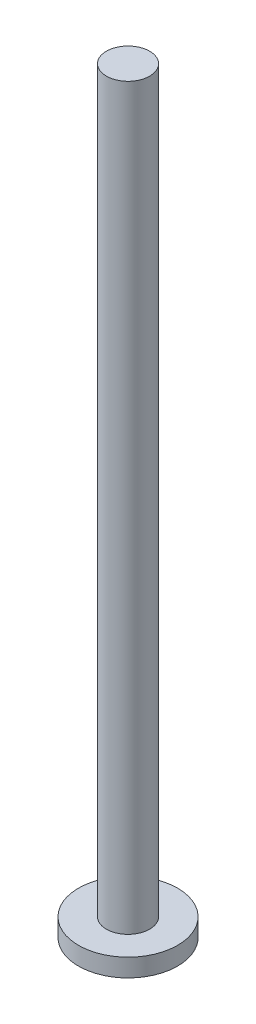
ISO-10303-21;
HEADER;
FILE_DESCRIPTION(('STEP AP214'),'2;1');
FILE_NAME('part.step','',(''),(''),'','','');
FILE_SCHEMA(('AUTOMOTIVE_DESIGN { 1 0 10303 214 1 1 1 1 }'));
ENDSEC;
DATA;
#1=APPLICATION_CONTEXT('core data for automotive mechanical design processes');
#2=APPLICATION_PROTOCOL_DEFINITION('international standard','automotive_design',2000,#1);
#3=PRODUCT_CONTEXT('',#1,'mechanical');
#4=PRODUCT('Part','Part','',(#3));
#5=PRODUCT_RELATED_PRODUCT_CATEGORY('part','',(#4));
#6=PRODUCT_DEFINITION_FORMATION('','',#4);
#7=PRODUCT_DEFINITION_CONTEXT('part definition',#1,'design');
#8=PRODUCT_DEFINITION('design','',#6,#7);
#9=PRODUCT_DEFINITION_SHAPE('','',#8);
#10=(LENGTH_UNIT() NAMED_UNIT(*) SI_UNIT(.MILLI.,.METRE.));
#11=(NAMED_UNIT(*) PLANE_ANGLE_UNIT() SI_UNIT($,.RADIAN.));
#12=(NAMED_UNIT(*) SI_UNIT($,.STERADIAN.) SOLID_ANGLE_UNIT());
#13=UNCERTAINTY_MEASURE_WITH_UNIT(LENGTH_MEASURE(1.E-05),#10,'distance_accuracy_value','');
#14=(GEOMETRIC_REPRESENTATION_CONTEXT(3) GLOBAL_UNCERTAINTY_ASSIGNED_CONTEXT((#13)) GLOBAL_UNIT_ASSIGNED_CONTEXT((#10,
#11,#12)) REPRESENTATION_CONTEXT('',''));
#15=CARTESIAN_POINT('',(0.,0.,0.));
#16=DIRECTION('',(0.,0.,1.));
#17=DIRECTION('',(1.,0.,0.));
#18=AXIS2_PLACEMENT_3D('',#15,#16,#17);
#19=CARTESIAN_POINT('',(0.,82.,0.));
#20=DIRECTION('',(0.,-1.,0.));
#21=DIRECTION('',(0.,0.,-1.));
#22=AXIS2_PLACEMENT_3D('',#19,#20,#21);
#23=CYLINDRICAL_SURFACE('',#22,2.4);
#24=CARTESIAN_POINT('',(0.,82.,0.));
#25=DIRECTION('',(0.,1.,0.));
#26=DIRECTION('',(0.,0.,1.));
#27=AXIS2_PLACEMENT_3D('',#24,#25,#26);
#28=CIRCLE('',#27,2.4);
#29=CARTESIAN_POINT('',(0.,82.,2.4));
#30=VERTEX_POINT('',#29);
#31=EDGE_CURVE('E10',#30,#30,#28,.T.);
#32=ORIENTED_EDGE('',*,*,#31,.F.);
#33=EDGE_LOOP('',(#32));
#34=FACE_BOUND('',#33,.T.);
#35=CARTESIAN_POINT('',(0.,0.,0.));
#36=DIRECTION('',(0.,1.,0.));
#37=DIRECTION('',(0.,0.,1.));
#38=AXIS2_PLACEMENT_3D('',#35,#36,#37);
#39=CIRCLE('',#38,2.4);
#40=CARTESIAN_POINT('',(0.,0.,2.4));
#41=VERTEX_POINT('',#40);
#42=EDGE_CURVE('E45',#41,#41,#39,.T.);
#43=ORIENTED_EDGE('',*,*,#42,.T.);
#44=EDGE_LOOP('',(#43));
#45=FACE_BOUND('',#44,.T.);
#46=ADVANCED_FACE('F42',(#34,#45),#23,.T.);
#47=CARTESIAN_POINT('',(0.,82.,0.));
#48=DIRECTION('',(0.,1.,0.));
#49=DIRECTION('',(0.,0.,1.));
#50=AXIS2_PLACEMENT_3D('',#47,#48,#49);
#51=PLANE('',#50);
#52=ORIENTED_EDGE('',*,*,#31,.T.);
#53=EDGE_LOOP('',(#52));
#54=FACE_BOUND('',#53,.T.);
#55=ADVANCED_FACE('F69',(#54),#51,.T.);
#56=CARTESIAN_POINT('',(0.,-2.,0.));
#57=DIRECTION('',(0.,1.,0.));
#58=DIRECTION('',(0.,0.,1.));
#59=AXIS2_PLACEMENT_3D('',#56,#57,#58);
#60=CYLINDRICAL_SURFACE('',#59,5.5);
#61=CARTESIAN_POINT('',(0.,-2.,0.));
#62=DIRECTION('',(0.,-1.,0.));
#63=DIRECTION('',(0.,0.,-1.));
#64=AXIS2_PLACEMENT_3D('',#61,#62,#63);
#65=CIRCLE('',#64,5.5);
#66=CARTESIAN_POINT('',(0.,-2.,-5.5));
#67=VERTEX_POINT('',#66);
#68=EDGE_CURVE('E55',#67,#67,#65,.T.);
#69=ORIENTED_EDGE('',*,*,#68,.F.);
#70=EDGE_LOOP('',(#69));
#71=FACE_BOUND('',#70,.T.);
#72=CARTESIAN_POINT('',(0.,0.,0.));
#73=DIRECTION('',(0.,-1.,0.));
#74=DIRECTION('',(0.,0.,-1.));
#75=AXIS2_PLACEMENT_3D('',#72,#73,#74);
#76=CIRCLE('',#75,5.5);
#77=CARTESIAN_POINT('',(0.,0.,-5.5));
#78=VERTEX_POINT('',#77);
#79=EDGE_CURVE('E57',#78,#78,#76,.T.);
#80=ORIENTED_EDGE('',*,*,#79,.T.);
#81=EDGE_LOOP('',(#80));
#82=FACE_BOUND('',#81,.T.);
#83=ADVANCED_FACE('F66',(#71,#82),#60,.T.);
#84=CARTESIAN_POINT('',(0.,-2.,0.));
#85=DIRECTION('',(0.,-1.,0.));
#86=DIRECTION('',(0.,0.,-1.));
#87=AXIS2_PLACEMENT_3D('',#84,#85,#86);
#88=PLANE('',#87);
#89=ORIENTED_EDGE('',*,*,#68,.T.);
#90=EDGE_LOOP('',(#89));
#91=FACE_BOUND('',#90,.T.);
#92=ADVANCED_FACE('F64',(#91),#88,.T.);
#93=CARTESIAN_POINT('',(0.,0.,0.));
#94=DIRECTION('',(0.,-1.,0.));
#95=DIRECTION('',(0.,0.,-1.));
#96=AXIS2_PLACEMENT_3D('',#93,#94,#95);
#97=PLANE('',#96);
#98=ORIENTED_EDGE('',*,*,#42,.F.);
#99=EDGE_LOOP('',(#98));
#100=FACE_BOUND('',#99,.T.);
#101=ORIENTED_EDGE('',*,*,#79,.F.);
#102=EDGE_LOOP('',(#101));
#103=FACE_BOUND('',#102,.T.);
#104=ADVANCED_FACE('F73',(#100,#103),#97,.F.);
#105=CLOSED_SHELL('',(#46,#55,#83,#92,#104));
#106=MANIFOLD_SOLID_BREP('B2',#105);
#107=ADVANCED_BREP_SHAPE_REPRESENTATION('',(#18,#106),#14);
#108=SHAPE_DEFINITION_REPRESENTATION(#9,#107);
ENDSEC;
END-ISO-10303-21;
